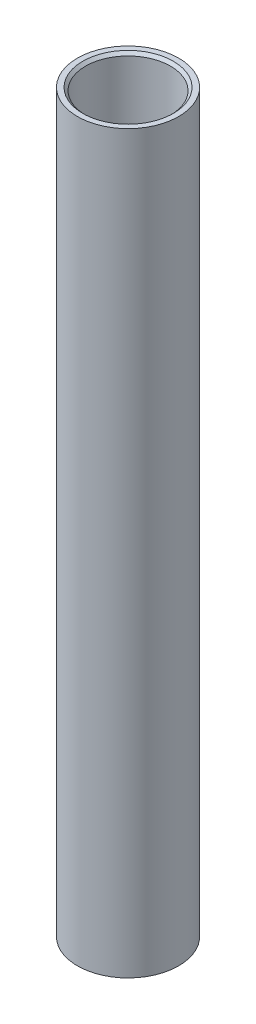
ISO-10303-21;
HEADER;
FILE_DESCRIPTION(('STEP AP214'),'2;1');
FILE_NAME('part.step','',(''),(''),'','','');
FILE_SCHEMA(('AUTOMOTIVE_DESIGN { 1 0 10303 214 1 1 1 1 }'));
ENDSEC;
DATA;
#1=APPLICATION_CONTEXT('core data for automotive mechanical design processes');
#2=APPLICATION_PROTOCOL_DEFINITION('international standard','automotive_design',2000,#1);
#3=PRODUCT_CONTEXT('',#1,'mechanical');
#4=PRODUCT('Part','Part','',(#3));
#5=PRODUCT_RELATED_PRODUCT_CATEGORY('part','',(#4));
#6=PRODUCT_DEFINITION_FORMATION('','',#4);
#7=PRODUCT_DEFINITION_CONTEXT('part definition',#1,'design');
#8=PRODUCT_DEFINITION('design','',#6,#7);
#9=PRODUCT_DEFINITION_SHAPE('','',#8);
#10=(LENGTH_UNIT() NAMED_UNIT(*) SI_UNIT(.MILLI.,.METRE.));
#11=(NAMED_UNIT(*) PLANE_ANGLE_UNIT() SI_UNIT($,.RADIAN.));
#12=(NAMED_UNIT(*) SI_UNIT($,.STERADIAN.) SOLID_ANGLE_UNIT());
#13=UNCERTAINTY_MEASURE_WITH_UNIT(LENGTH_MEASURE(1.E-05),#10,'distance_accuracy_value','');
#14=(GEOMETRIC_REPRESENTATION_CONTEXT(3) GLOBAL_UNCERTAINTY_ASSIGNED_CONTEXT((#13)) GLOBAL_UNIT_ASSIGNED_CONTEXT((#10,
#11,#12)) REPRESENTATION_CONTEXT('',''));
#15=CARTESIAN_POINT('',(0.,0.,0.));
#16=DIRECTION('',(0.,0.,1.));
#17=DIRECTION('',(1.,0.,0.));
#18=AXIS2_PLACEMENT_3D('',#15,#16,#17);
#19=CARTESIAN_POINT('',(0.,0.,0.));
#20=DIRECTION('',(0.,-1.,0.));
#21=DIRECTION('',(0.,0.,-1.));
#22=AXIS2_PLACEMENT_3D('',#19,#20,#21);
#23=CYLINDRICAL_SURFACE('',#22,3.75);
#24=CARTESIAN_POINT('',(0.,-0.249936139788081,0.));
#25=DIRECTION('',(0.,1.,0.));
#26=DIRECTION('',(-1.,0.,0.));
#27=AXIS2_PLACEMENT_3D('',#24,#25,#26);
#28=CIRCLE('',#27,3.75);
#29=CARTESIAN_POINT('',(-3.74999999999999,-0.249936139788081,0.));
#30=VERTEX_POINT('',#29);
#31=EDGE_CURVE('E34',#30,#30,#28,.T.);
#32=ORIENTED_EDGE('',*,*,#31,.T.);
#33=EDGE_LOOP('',(#32));
#34=FACE_BOUND('',#33,.T.);
#35=CARTESIAN_POINT('',(0.,-64.7500638602097,0.));
#36=DIRECTION('',(0.,-1.,0.));
#37=DIRECTION('',(0.,0.,-1.));
#38=AXIS2_PLACEMENT_3D('',#35,#36,#37);
#39=CIRCLE('',#38,3.75);
#40=CARTESIAN_POINT('',(0.,-64.7500638602097,-3.75));
#41=VERTEX_POINT('',#40);
#42=EDGE_CURVE('E18',#41,#41,#39,.T.);
#43=ORIENTED_EDGE('',*,*,#42,.T.);
#44=EDGE_LOOP('',(#43));
#45=FACE_BOUND('',#44,.T.);
#46=ADVANCED_FACE('F15',(#34,#45),#23,.F.);
#47=CARTESIAN_POINT('',(0.,-65.0000287351418,0.));
#48=DIRECTION('',(0.,-1.,0.));
#49=DIRECTION('',(0.,0.,-1.));
#50=AXIS2_PLACEMENT_3D('',#47,#48,#49);
#51=CONICAL_SURFACE('',#50,3.99996061827324,0.785389648810886);
#52=ORIENTED_EDGE('',*,*,#42,.F.);
#53=EDGE_LOOP('',(#52));
#54=FACE_BOUND('',#53,.T.);
#55=CARTESIAN_POINT('',(0.,-65.,0.));
#56=DIRECTION('',(0.,-1.,0.));
#57=DIRECTION('',(0.,0.,-1.));
#58=AXIS2_PLACEMENT_3D('',#55,#56,#57);
#59=CIRCLE('',#58,3.9999318836208);
#60=CARTESIAN_POINT('',(0.,-65.,-3.9999318836208));
#61=VERTEX_POINT('',#60);
#62=EDGE_CURVE('E32',#61,#61,#59,.F.);
#63=ORIENTED_EDGE('',*,*,#62,.F.);
#64=EDGE_LOOP('',(#63));
#65=FACE_BOUND('',#64,.T.);
#66=ADVANCED_FACE('F42',(#54,#65),#51,.F.);
#67=CARTESIAN_POINT('',(0.,2.87352577288402E-05,0.));
#68=DIRECTION('',(0.,1.,0.));
#69=DIRECTION('',(-1.,0.,0.));
#70=AXIS2_PLACEMENT_3D('',#67,#68,#69);
#71=CONICAL_SURFACE('',#70,3.99996061838692,0.785389648810888);
#72=ORIENTED_EDGE('',*,*,#31,.F.);
#73=EDGE_LOOP('',(#72));
#74=FACE_BOUND('',#73,.T.);
#75=CARTESIAN_POINT('',(0.,0.,0.));
#76=DIRECTION('',(0.,-1.,0.));
#77=DIRECTION('',(0.,0.,-1.));
#78=AXIS2_PLACEMENT_3D('',#75,#76,#77);
#79=CIRCLE('',#78,3.99993188361853);
#80=CARTESIAN_POINT('',(0.,0.,-3.99993188361853));
#81=VERTEX_POINT('',#80);
#82=EDGE_CURVE('E27',#81,#81,#79,.F.);
#83=ORIENTED_EDGE('',*,*,#82,.T.);
#84=EDGE_LOOP('',(#83));
#85=FACE_BOUND('',#84,.T.);
#86=ADVANCED_FACE('F45',(#74,#85),#71,.F.);
#87=CARTESIAN_POINT('',(0.,-65.,0.));
#88=DIRECTION('',(0.,-1.,0.));
#89=DIRECTION('',(0.,0.,-1.));
#90=AXIS2_PLACEMENT_3D('',#87,#88,#89);
#91=PLANE('',#90);
#92=ORIENTED_EDGE('',*,*,#62,.T.);
#93=EDGE_LOOP('',(#92));
#94=FACE_BOUND('',#93,.T.);
#95=CARTESIAN_POINT('',(0.,-65.,0.));
#96=DIRECTION('',(0.,-1.,0.));
#97=DIRECTION('',(0.,0.,-1.));
#98=AXIS2_PLACEMENT_3D('',#95,#96,#97);
#99=CIRCLE('',#98,4.475);
#100=CARTESIAN_POINT('',(0.,-65.,-4.475));
#101=VERTEX_POINT('',#100);
#102=EDGE_CURVE('E22',#101,#101,#99,.F.);
#103=ORIENTED_EDGE('',*,*,#102,.F.);
#104=EDGE_LOOP('',(#103));
#105=FACE_BOUND('',#104,.T.);
#106=ADVANCED_FACE('F48',(#94,#105),#91,.T.);
#107=CARTESIAN_POINT('',(0.,0.,0.));
#108=DIRECTION('',(0.,-1.,0.));
#109=DIRECTION('',(0.,0.,-1.));
#110=AXIS2_PLACEMENT_3D('',#107,#108,#109);
#111=PLANE('',#110);
#112=ORIENTED_EDGE('',*,*,#82,.F.);
#113=EDGE_LOOP('',(#112));
#114=FACE_BOUND('',#113,.T.);
#115=CARTESIAN_POINT('',(0.,0.,0.));
#116=DIRECTION('',(0.,-1.,0.));
#117=DIRECTION('',(0.,0.,-1.));
#118=AXIS2_PLACEMENT_3D('',#115,#116,#117);
#119=CIRCLE('',#118,4.475);
#120=CARTESIAN_POINT('',(0.,0.,-4.475));
#121=VERTEX_POINT('',#120);
#122=EDGE_CURVE('E10',#121,#121,#119,.T.);
#123=ORIENTED_EDGE('',*,*,#122,.F.);
#124=EDGE_LOOP('',(#123));
#125=FACE_BOUND('',#124,.T.);
#126=ADVANCED_FACE('F51',(#114,#125),#111,.F.);
#127=CARTESIAN_POINT('',(0.,0.,0.));
#128=DIRECTION('',(0.,-1.,0.));
#129=DIRECTION('',(0.,0.,-1.));
#130=AXIS2_PLACEMENT_3D('',#127,#128,#129);
#131=CYLINDRICAL_SURFACE('',#130,4.475);
#132=ORIENTED_EDGE('',*,*,#102,.T.);
#133=EDGE_LOOP('',(#132));
#134=FACE_BOUND('',#133,.T.);
#135=ORIENTED_EDGE('',*,*,#122,.T.);
#136=EDGE_LOOP('',(#135));
#137=FACE_BOUND('',#136,.T.);
#138=ADVANCED_FACE('F55',(#134,#137),#131,.T.);
#139=CLOSED_SHELL('',(#46,#66,#86,#106,#126,#138));
#140=MANIFOLD_SOLID_BREP('B1',#139);
#141=ADVANCED_BREP_SHAPE_REPRESENTATION('',(#18,#140),#14);
#142=SHAPE_DEFINITION_REPRESENTATION(#9,#141);
ENDSEC;
END-ISO-10303-21;
